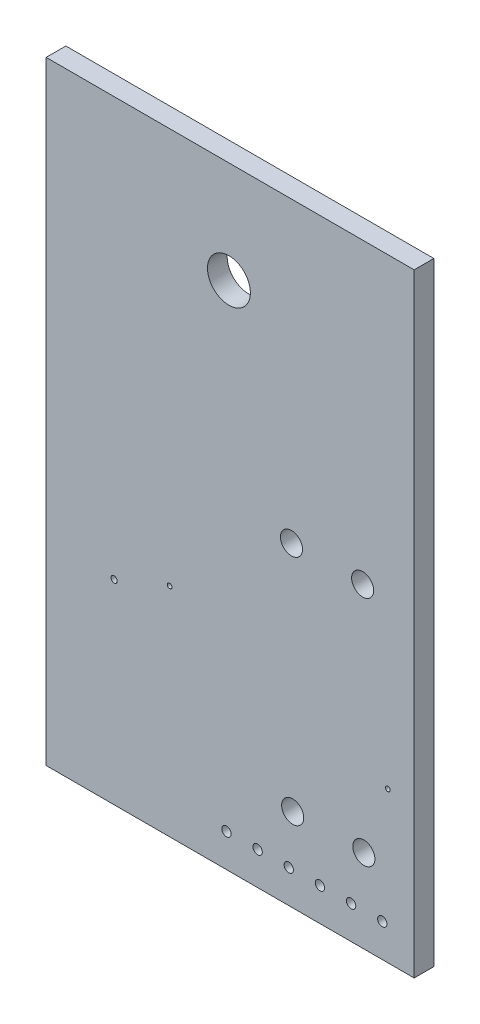
ISO-10303-21;
HEADER;
FILE_DESCRIPTION(('STEP AP214'),'2;1');
FILE_NAME('part.step','',(''),(''),'','','');
FILE_SCHEMA(('AUTOMOTIVE_DESIGN { 1 0 10303 214 1 1 1 1 }'));
ENDSEC;
DATA;
#1=APPLICATION_CONTEXT('core data for automotive mechanical design processes');
#2=APPLICATION_PROTOCOL_DEFINITION('international standard','automotive_design',2000,#1);
#3=PRODUCT_CONTEXT('',#1,'mechanical');
#4=PRODUCT('Part','Part','',(#3));
#5=PRODUCT_RELATED_PRODUCT_CATEGORY('part','',(#4));
#6=PRODUCT_DEFINITION_FORMATION('','',#4);
#7=PRODUCT_DEFINITION_CONTEXT('part definition',#1,'design');
#8=PRODUCT_DEFINITION('design','',#6,#7);
#9=PRODUCT_DEFINITION_SHAPE('','',#8);
#10=(LENGTH_UNIT() NAMED_UNIT(*) SI_UNIT(.MILLI.,.METRE.));
#11=(NAMED_UNIT(*) PLANE_ANGLE_UNIT() SI_UNIT($,.RADIAN.));
#12=(NAMED_UNIT(*) SI_UNIT($,.STERADIAN.) SOLID_ANGLE_UNIT());
#13=UNCERTAINTY_MEASURE_WITH_UNIT(LENGTH_MEASURE(1.E-05),#10,'distance_accuracy_value','');
#14=(GEOMETRIC_REPRESENTATION_CONTEXT(3) GLOBAL_UNCERTAINTY_ASSIGNED_CONTEXT((#13)) GLOBAL_UNIT_ASSIGNED_CONTEXT((#10,
#11,#12)) REPRESENTATION_CONTEXT('',''));
#15=CARTESIAN_POINT('',(0.,0.,0.));
#16=DIRECTION('',(0.,0.,1.));
#17=DIRECTION('',(1.,0.,0.));
#18=AXIS2_PLACEMENT_3D('',#15,#16,#17);
#19=CARTESIAN_POINT('',(0.,50.,-0.803));
#20=DIRECTION('',(0.,0.,-1.));
#21=DIRECTION('',(-1.,0.,0.));
#22=AXIS2_PLACEMENT_3D('',#19,#20,#21);
#23=PLANE('',#22);
#24=CARTESIAN_POINT('',(-24.45854,15.91271,-0.803));
#25=DIRECTION('',(0.,0.,-1.));
#26=DIRECTION('',(-1.,0.,0.));
#27=AXIS2_PLACEMENT_3D('',#24,#25,#26);
#28=CIRCLE('',#27,0.254);
#29=CARTESIAN_POINT('',(-24.71254,15.91271,-0.803));
#30=VERTEX_POINT('',#29);
#31=EDGE_CURVE('E119',#30,#30,#28,.F.);
#32=ORIENTED_EDGE('',*,*,#31,.T.);
#33=EDGE_LOOP('',(#32));
#34=FACE_BOUND('',#33,.T.);
#35=CARTESIAN_POINT('',(-19.93533,17.71295,-0.803));
#36=DIRECTION('',(0.,0.,-1.));
#37=DIRECTION('',(-1.,0.,0.));
#38=AXIS2_PLACEMENT_3D('',#35,#36,#37);
#39=CIRCLE('',#38,0.1905);
#40=CARTESIAN_POINT('',(-20.12583,17.71295,-0.803));
#41=VERTEX_POINT('',#40);
#42=EDGE_CURVE('E122',#41,#41,#39,.F.);
#43=ORIENTED_EDGE('',*,*,#42,.T.);
#44=EDGE_LOOP('',(#43));
#45=FACE_BOUND('',#44,.T.);
#46=CARTESIAN_POINT('',(-15.1,41.7,-0.803));
#47=DIRECTION('',(0.,0.,-1.));
#48=DIRECTION('',(-1.,0.,0.));
#49=AXIS2_PLACEMENT_3D('',#46,#47,#48);
#50=CIRCLE('',#49,1.75);
#51=CARTESIAN_POINT('',(-16.85,41.7,-0.803));
#52=VERTEX_POINT('',#51);
#53=EDGE_CURVE('E125',#52,#52,#50,.F.);
#54=ORIENTED_EDGE('',*,*,#53,.T.);
#55=EDGE_LOOP('',(#54));
#56=FACE_BOUND('',#55,.T.);
#57=CARTESIAN_POINT('',(-12.76,2.7,-0.803));
#58=DIRECTION('',(0.,0.,-1.));
#59=DIRECTION('',(-1.,0.,0.));
#60=AXIS2_PLACEMENT_3D('',#57,#58,#59);
#61=CIRCLE('',#60,0.381);
#62=CARTESIAN_POINT('',(-13.141,2.7,-0.803));
#63=VERTEX_POINT('',#62);
#64=EDGE_CURVE('E128',#63,#63,#61,.F.);
#65=ORIENTED_EDGE('',*,*,#64,.T.);
#66=EDGE_LOOP('',(#65));
#67=FACE_BOUND('',#66,.T.);
#68=CARTESIAN_POINT('',(-15.3,2.7,-0.803));
#69=DIRECTION('',(0.,0.,-1.));
#70=DIRECTION('',(-1.,0.,0.));
#71=AXIS2_PLACEMENT_3D('',#68,#69,#70);
#72=CIRCLE('',#71,0.381);
#73=CARTESIAN_POINT('',(-15.681,2.7,-0.803));
#74=VERTEX_POINT('',#73);
#75=EDGE_CURVE('E131',#74,#74,#72,.F.);
#76=ORIENTED_EDGE('',*,*,#75,.T.);
#77=EDGE_LOOP('',(#76));
#78=FACE_BOUND('',#77,.T.);
#79=CARTESIAN_POINT('',(-9.9,6.8,-0.803));
#80=DIRECTION('',(0.,0.,-1.));
#81=DIRECTION('',(-1.,0.,0.));
#82=AXIS2_PLACEMENT_3D('',#79,#80,#81);
#83=CIRCLE('',#82,0.9);
#84=CARTESIAN_POINT('',(-10.8,6.8,-0.803));
#85=VERTEX_POINT('',#84);
#86=EDGE_CURVE('E134',#85,#85,#83,.F.);
#87=ORIENTED_EDGE('',*,*,#86,.T.);
#88=EDGE_LOOP('',(#87));
#89=FACE_BOUND('',#88,.T.);
#90=CARTESIAN_POINT('',(-10.22,2.7,-0.803));
#91=DIRECTION('',(0.,0.,-1.));
#92=DIRECTION('',(-1.,0.,0.));
#93=AXIS2_PLACEMENT_3D('',#90,#91,#92);
#94=CIRCLE('',#93,0.381);
#95=CARTESIAN_POINT('',(-10.601,2.7,-0.803));
#96=VERTEX_POINT('',#95);
#97=EDGE_CURVE('E137',#96,#96,#94,.F.);
#98=ORIENTED_EDGE('',*,*,#97,.T.);
#99=EDGE_LOOP('',(#98));
#100=FACE_BOUND('',#99,.T.);
#101=CARTESIAN_POINT('',(-4.1,6.8,-0.803));
#102=DIRECTION('',(0.,0.,-1.));
#103=DIRECTION('',(-1.,0.,0.));
#104=AXIS2_PLACEMENT_3D('',#101,#102,#103);
#105=CIRCLE('',#104,0.9);
#106=CARTESIAN_POINT('',(-5.,6.8,-0.803));
#107=VERTEX_POINT('',#106);
#108=EDGE_CURVE('E140',#107,#107,#105,.F.);
#109=ORIENTED_EDGE('',*,*,#108,.T.);
#110=EDGE_LOOP('',(#109));
#111=FACE_BOUND('',#110,.T.);
#112=CARTESIAN_POINT('',(-5.14,2.7,-0.803));
#113=DIRECTION('',(0.,0.,-1.));
#114=DIRECTION('',(-1.,0.,0.));
#115=AXIS2_PLACEMENT_3D('',#112,#113,#114);
#116=CIRCLE('',#115,0.381);
#117=CARTESIAN_POINT('',(-5.521,2.7,-0.803));
#118=VERTEX_POINT('',#117);
#119=EDGE_CURVE('E143',#118,#118,#116,.F.);
#120=ORIENTED_EDGE('',*,*,#119,.T.);
#121=EDGE_LOOP('',(#120));
#122=FACE_BOUND('',#121,.T.);
#123=CARTESIAN_POINT('',(-7.68,2.7,-0.803));
#124=DIRECTION('',(0.,0.,-1.));
#125=DIRECTION('',(-1.,0.,0.));
#126=AXIS2_PLACEMENT_3D('',#123,#124,#125);
#127=CIRCLE('',#126,0.381);
#128=CARTESIAN_POINT('',(-8.061,2.7,-0.803));
#129=VERTEX_POINT('',#128);
#130=EDGE_CURVE('E146',#129,#129,#127,.F.);
#131=ORIENTED_EDGE('',*,*,#130,.T.);
#132=EDGE_LOOP('',(#131));
#133=FACE_BOUND('',#132,.T.);
#134=CARTESIAN_POINT('',(-2.15327,12.27531,-0.803));
#135=DIRECTION('',(0.,0.,-1.));
#136=DIRECTION('',(-1.,0.,0.));
#137=AXIS2_PLACEMENT_3D('',#134,#135,#136);
#138=CIRCLE('',#137,0.1905);
#139=CARTESIAN_POINT('',(-2.34377,12.27531,-0.803));
#140=VERTEX_POINT('',#139);
#141=EDGE_CURVE('E149',#140,#140,#138,.F.);
#142=ORIENTED_EDGE('',*,*,#141,.T.);
#143=EDGE_LOOP('',(#142));
#144=FACE_BOUND('',#143,.T.);
#145=CARTESIAN_POINT('',(-2.6,2.7,-0.803));
#146=DIRECTION('',(0.,0.,-1.));
#147=DIRECTION('',(-1.,0.,0.));
#148=AXIS2_PLACEMENT_3D('',#145,#146,#147);
#149=CIRCLE('',#148,0.381);
#150=CARTESIAN_POINT('',(-2.981,2.7,-0.803));
#151=VERTEX_POINT('',#150);
#152=EDGE_CURVE('E152',#151,#151,#149,.F.);
#153=ORIENTED_EDGE('',*,*,#152,.T.);
#154=EDGE_LOOP('',(#153));
#155=FACE_BOUND('',#154,.T.);
#156=CARTESIAN_POINT('',(-4.2,25.7,-0.803));
#157=DIRECTION('',(0.,0.,-1.));
#158=DIRECTION('',(-1.,0.,0.));
#159=AXIS2_PLACEMENT_3D('',#156,#157,#158);
#160=CIRCLE('',#159,0.9);
#161=CARTESIAN_POINT('',(-5.1,25.7,-0.803));
#162=VERTEX_POINT('',#161);
#163=EDGE_CURVE('E154',#162,#162,#160,.F.);
#164=ORIENTED_EDGE('',*,*,#163,.T.);
#165=EDGE_LOOP('',(#164));
#166=FACE_BOUND('',#165,.T.);
#167=CARTESIAN_POINT('',(-10.,25.7,-0.803));
#168=DIRECTION('',(0.,0.,-1.));
#169=DIRECTION('',(-1.,0.,0.));
#170=AXIS2_PLACEMENT_3D('',#167,#168,#169);
#171=CIRCLE('',#170,0.9);
#172=CARTESIAN_POINT('',(-10.9,25.7,-0.803));
#173=VERTEX_POINT('',#172);
#174=EDGE_CURVE('E20',#173,#173,#171,.F.);
#175=ORIENTED_EDGE('',*,*,#174,.T.);
#176=EDGE_LOOP('',(#175));
#177=FACE_BOUND('',#176,.T.);
#178=DIRECTION('',(1.,0.,0.));
#179=VECTOR('',#178,1.);
#180=CARTESIAN_POINT('',(-30.,0.,-0.803));
#181=LINE('',#180,#179);
#182=CARTESIAN_POINT('',(0.,0.,-0.803));
#183=VERTEX_POINT('',#182);
#184=CARTESIAN_POINT('',(-30.,0.,-0.803));
#185=VERTEX_POINT('',#184);
#186=EDGE_CURVE('E168',#183,#185,#181,.F.);
#187=ORIENTED_EDGE('',*,*,#186,.T.);
#188=DIRECTION('',(0.,1.,0.));
#189=VECTOR('',#188,1.);
#190=CARTESIAN_POINT('',(-30.,50.,-0.803));
#191=LINE('',#190,#189);
#192=CARTESIAN_POINT('',(-30.,50.,-0.803));
#193=VERTEX_POINT('',#192);
#194=EDGE_CURVE('E60',#185,#193,#191,.T.);
#195=ORIENTED_EDGE('',*,*,#194,.T.);
#196=DIRECTION('',(1.,0.,0.));
#197=VECTOR('',#196,1.);
#198=CARTESIAN_POINT('',(0.,50.,-0.803));
#199=LINE('',#198,#197);
#200=CARTESIAN_POINT('',(0.,50.,-0.803));
#201=VERTEX_POINT('',#200);
#202=EDGE_CURVE('E59',#193,#201,#199,.T.);
#203=ORIENTED_EDGE('',*,*,#202,.T.);
#204=DIRECTION('',(0.,1.,0.));
#205=VECTOR('',#204,1.);
#206=CARTESIAN_POINT('',(0.,0.,-0.803));
#207=LINE('',#206,#205);
#208=EDGE_CURVE('E56',#201,#183,#207,.F.);
#209=ORIENTED_EDGE('',*,*,#208,.T.);
#210=EDGE_LOOP('',(#187,#195,#203,#209));
#211=FACE_BOUND('',#210,.T.);
#212=ADVANCED_FACE('F17',(#34,#45,#56,#67,#78,#89,#100,#111,#122,#133,#144,#155,#166,#177,#211),
#23,.T.);
#213=CARTESIAN_POINT('',(0.,50.,-0.803));
#214=DIRECTION('',(0.,-1.,0.));
#215=DIRECTION('',(0.,0.,-1.));
#216=AXIS2_PLACEMENT_3D('',#213,#214,#215);
#217=PLANE('',#216);
#218=DIRECTION('',(0.,0.,-1.));
#219=VECTOR('',#218,1.);
#220=CARTESIAN_POINT('',(-30.,50.,-0.803));
#221=LINE('',#220,#219);
#222=CARTESIAN_POINT('',(-30.,50.,0.803));
#223=VERTEX_POINT('',#222);
#224=EDGE_CURVE('E162',#193,#223,#221,.F.);
#225=ORIENTED_EDGE('',*,*,#224,.T.);
#226=DIRECTION('',(-1.,0.,0.));
#227=VECTOR('',#226,1.);
#228=CARTESIAN_POINT('',(0.,50.,0.803));
#229=LINE('',#228,#227);
#230=CARTESIAN_POINT('',(0.,50.,0.803));
#231=VERTEX_POINT('',#230);
#232=EDGE_CURVE('E76',#223,#231,#229,.F.);
#233=ORIENTED_EDGE('',*,*,#232,.T.);
#234=DIRECTION('',(0.,0.,1.));
#235=VECTOR('',#234,1.);
#236=CARTESIAN_POINT('',(0.,50.,-0.803));
#237=LINE('',#236,#235);
#238=EDGE_CURVE('E65',#231,#201,#237,.F.);
#239=ORIENTED_EDGE('',*,*,#238,.T.);
#240=ORIENTED_EDGE('',*,*,#202,.F.);
#241=EDGE_LOOP('',(#225,#233,#239,#240));
#242=FACE_BOUND('',#241,.T.);
#243=ADVANCED_FACE('F75',(#242),#217,.F.);
#244=CARTESIAN_POINT('',(0.,0.,-0.803));
#245=DIRECTION('',(-1.,0.,0.));
#246=DIRECTION('',(0.,0.,1.));
#247=AXIS2_PLACEMENT_3D('',#244,#245,#246);
#248=PLANE('',#247);
#249=ORIENTED_EDGE('',*,*,#238,.F.);
#250=DIRECTION('',(0.,1.,0.));
#251=VECTOR('',#250,1.);
#252=CARTESIAN_POINT('',(0.,50.,0.803));
#253=LINE('',#252,#251);
#254=CARTESIAN_POINT('',(0.,0.,0.803));
#255=VERTEX_POINT('',#254);
#256=EDGE_CURVE('E176',#231,#255,#253,.F.);
#257=ORIENTED_EDGE('',*,*,#256,.T.);
#258=DIRECTION('',(0.,0.,1.));
#259=VECTOR('',#258,1.);
#260=CARTESIAN_POINT('',(0.,0.,-0.803));
#261=LINE('',#260,#259);
#262=EDGE_CURVE('E72',#255,#183,#261,.F.);
#263=ORIENTED_EDGE('',*,*,#262,.T.);
#264=ORIENTED_EDGE('',*,*,#208,.F.);
#265=EDGE_LOOP('',(#249,#257,#263,#264));
#266=FACE_BOUND('',#265,.T.);
#267=ADVANCED_FACE('F69',(#266),#248,.F.);
#268=CARTESIAN_POINT('',(-30.,0.,-0.803));
#269=DIRECTION('',(0.,1.,0.));
#270=DIRECTION('',(0.,0.,1.));
#271=AXIS2_PLACEMENT_3D('',#268,#269,#270);
#272=PLANE('',#271);
#273=ORIENTED_EDGE('',*,*,#262,.F.);
#274=DIRECTION('',(-1.,0.,0.));
#275=VECTOR('',#274,1.);
#276=CARTESIAN_POINT('',(0.,0.,0.803));
#277=LINE('',#276,#275);
#278=CARTESIAN_POINT('',(-30.,0.,0.803));
#279=VERTEX_POINT('',#278);
#280=EDGE_CURVE('E174',#255,#279,#277,.T.);
#281=ORIENTED_EDGE('',*,*,#280,.T.);
#282=DIRECTION('',(0.,0.,-1.));
#283=VECTOR('',#282,1.);
#284=CARTESIAN_POINT('',(-30.,0.,-0.803));
#285=LINE('',#284,#283);
#286=EDGE_CURVE('E35',#279,#185,#285,.T.);
#287=ORIENTED_EDGE('',*,*,#286,.T.);
#288=ORIENTED_EDGE('',*,*,#186,.F.);
#289=EDGE_LOOP('',(#273,#281,#287,#288));
#290=FACE_BOUND('',#289,.T.);
#291=ADVANCED_FACE('F172',(#290),#272,.F.);
#292=CARTESIAN_POINT('',(-30.,50.,-0.803));
#293=DIRECTION('',(1.,0.,0.));
#294=DIRECTION('',(0.,0.,-1.));
#295=AXIS2_PLACEMENT_3D('',#292,#293,#294);
#296=PLANE('',#295);
#297=ORIENTED_EDGE('',*,*,#286,.F.);
#298=DIRECTION('',(0.,1.,0.));
#299=VECTOR('',#298,1.);
#300=CARTESIAN_POINT('',(-30.,50.,0.803));
#301=LINE('',#300,#299);
#302=EDGE_CURVE('E118',#279,#223,#301,.T.);
#303=ORIENTED_EDGE('',*,*,#302,.T.);
#304=ORIENTED_EDGE('',*,*,#224,.F.);
#305=ORIENTED_EDGE('',*,*,#194,.F.);
#306=EDGE_LOOP('',(#297,#303,#304,#305));
#307=FACE_BOUND('',#306,.T.);
#308=ADVANCED_FACE('F170',(#307),#296,.F.);
#309=CARTESIAN_POINT('',(-10.,25.7,-0.803));
#310=DIRECTION('',(0.,0.,-1.));
#311=DIRECTION('',(-1.,0.,0.));
#312=AXIS2_PLACEMENT_3D('',#309,#310,#311);
#313=CYLINDRICAL_SURFACE('',#312,0.9);
#314=CARTESIAN_POINT('',(-10.,25.7,0.803));
#315=DIRECTION('',(0.,0.,-1.));
#316=DIRECTION('',(-1.,0.,0.));
#317=AXIS2_PLACEMENT_3D('',#314,#315,#316);
#318=CIRCLE('',#317,0.9);
#319=CARTESIAN_POINT('',(-10.9,25.7,0.803));
#320=VERTEX_POINT('',#319);
#321=EDGE_CURVE('E115',#320,#320,#318,.F.);
#322=ORIENTED_EDGE('',*,*,#321,.T.);
#323=EDGE_LOOP('',(#322));
#324=FACE_BOUND('',#323,.T.);
#325=ORIENTED_EDGE('',*,*,#174,.F.);
#326=EDGE_LOOP('',(#325));
#327=FACE_BOUND('',#326,.T.);
#328=ADVANCED_FACE('F240',(#324,#327),#313,.F.);
#329=CARTESIAN_POINT('',(-4.2,25.7,-0.803));
#330=DIRECTION('',(0.,0.,-1.));
#331=DIRECTION('',(-1.,0.,0.));
#332=AXIS2_PLACEMENT_3D('',#329,#330,#331);
#333=CYLINDRICAL_SURFACE('',#332,0.9);
#334=CARTESIAN_POINT('',(-4.2,25.7,0.803));
#335=DIRECTION('',(0.,0.,-1.));
#336=DIRECTION('',(-1.,0.,0.));
#337=AXIS2_PLACEMENT_3D('',#334,#335,#336);
#338=CIRCLE('',#337,0.9);
#339=CARTESIAN_POINT('',(-5.1,25.7,0.803));
#340=VERTEX_POINT('',#339);
#341=EDGE_CURVE('E112',#340,#340,#338,.F.);
#342=ORIENTED_EDGE('',*,*,#341,.T.);
#343=EDGE_LOOP('',(#342));
#344=FACE_BOUND('',#343,.T.);
#345=ORIENTED_EDGE('',*,*,#163,.F.);
#346=EDGE_LOOP('',(#345));
#347=FACE_BOUND('',#346,.T.);
#348=ADVANCED_FACE('F236',(#344,#347),#333,.F.);
#349=CARTESIAN_POINT('',(-2.6,2.7,-0.803));
#350=DIRECTION('',(0.,0.,-1.));
#351=DIRECTION('',(-1.,0.,0.));
#352=AXIS2_PLACEMENT_3D('',#349,#350,#351);
#353=CYLINDRICAL_SURFACE('',#352,0.381);
#354=CARTESIAN_POINT('',(-2.6,2.7,0.803));
#355=DIRECTION('',(0.,0.,-1.));
#356=DIRECTION('',(-1.,0.,0.));
#357=AXIS2_PLACEMENT_3D('',#354,#355,#356);
#358=CIRCLE('',#357,0.381);
#359=CARTESIAN_POINT('',(-2.981,2.7,0.803));
#360=VERTEX_POINT('',#359);
#361=EDGE_CURVE('E109',#360,#360,#358,.F.);
#362=ORIENTED_EDGE('',*,*,#361,.T.);
#363=EDGE_LOOP('',(#362));
#364=FACE_BOUND('',#363,.T.);
#365=ORIENTED_EDGE('',*,*,#152,.F.);
#366=EDGE_LOOP('',(#365));
#367=FACE_BOUND('',#366,.T.);
#368=ADVANCED_FACE('F232',(#364,#367),#353,.F.);
#369=CARTESIAN_POINT('',(-2.15327,12.27531,-0.803));
#370=DIRECTION('',(0.,0.,-1.));
#371=DIRECTION('',(-1.,0.,0.));
#372=AXIS2_PLACEMENT_3D('',#369,#370,#371);
#373=CYLINDRICAL_SURFACE('',#372,0.1905);
#374=CARTESIAN_POINT('',(-2.15327,12.27531,0.803));
#375=DIRECTION('',(0.,0.,-1.));
#376=DIRECTION('',(-1.,0.,0.));
#377=AXIS2_PLACEMENT_3D('',#374,#375,#376);
#378=CIRCLE('',#377,0.1905);
#379=CARTESIAN_POINT('',(-2.34377,12.27531,0.803));
#380=VERTEX_POINT('',#379);
#381=EDGE_CURVE('E106',#380,#380,#378,.F.);
#382=ORIENTED_EDGE('',*,*,#381,.T.);
#383=EDGE_LOOP('',(#382));
#384=FACE_BOUND('',#383,.T.);
#385=ORIENTED_EDGE('',*,*,#141,.F.);
#386=EDGE_LOOP('',(#385));
#387=FACE_BOUND('',#386,.T.);
#388=ADVANCED_FACE('F228',(#384,#387),#373,.F.);
#389=CARTESIAN_POINT('',(-7.68,2.7,-0.803));
#390=DIRECTION('',(0.,0.,-1.));
#391=DIRECTION('',(-1.,0.,0.));
#392=AXIS2_PLACEMENT_3D('',#389,#390,#391);
#393=CYLINDRICAL_SURFACE('',#392,0.381);
#394=CARTESIAN_POINT('',(-7.68,2.7,0.803));
#395=DIRECTION('',(0.,0.,-1.));
#396=DIRECTION('',(-1.,0.,0.));
#397=AXIS2_PLACEMENT_3D('',#394,#395,#396);
#398=CIRCLE('',#397,0.381);
#399=CARTESIAN_POINT('',(-8.061,2.7,0.803));
#400=VERTEX_POINT('',#399);
#401=EDGE_CURVE('E103',#400,#400,#398,.F.);
#402=ORIENTED_EDGE('',*,*,#401,.T.);
#403=EDGE_LOOP('',(#402));
#404=FACE_BOUND('',#403,.T.);
#405=ORIENTED_EDGE('',*,*,#130,.F.);
#406=EDGE_LOOP('',(#405));
#407=FACE_BOUND('',#406,.T.);
#408=ADVANCED_FACE('F224',(#404,#407),#393,.F.);
#409=CARTESIAN_POINT('',(-5.14,2.7,-0.803));
#410=DIRECTION('',(0.,0.,-1.));
#411=DIRECTION('',(-1.,0.,0.));
#412=AXIS2_PLACEMENT_3D('',#409,#410,#411);
#413=CYLINDRICAL_SURFACE('',#412,0.381);
#414=CARTESIAN_POINT('',(-5.14,2.7,0.803));
#415=DIRECTION('',(0.,0.,-1.));
#416=DIRECTION('',(-1.,0.,0.));
#417=AXIS2_PLACEMENT_3D('',#414,#415,#416);
#418=CIRCLE('',#417,0.381);
#419=CARTESIAN_POINT('',(-5.521,2.7,0.803));
#420=VERTEX_POINT('',#419);
#421=EDGE_CURVE('E100',#420,#420,#418,.F.);
#422=ORIENTED_EDGE('',*,*,#421,.T.);
#423=EDGE_LOOP('',(#422));
#424=FACE_BOUND('',#423,.T.);
#425=ORIENTED_EDGE('',*,*,#119,.F.);
#426=EDGE_LOOP('',(#425));
#427=FACE_BOUND('',#426,.T.);
#428=ADVANCED_FACE('F220',(#424,#427),#413,.F.);
#429=CARTESIAN_POINT('',(-4.1,6.8,-0.803));
#430=DIRECTION('',(0.,0.,-1.));
#431=DIRECTION('',(-1.,0.,0.));
#432=AXIS2_PLACEMENT_3D('',#429,#430,#431);
#433=CYLINDRICAL_SURFACE('',#432,0.9);
#434=CARTESIAN_POINT('',(-4.1,6.8,0.803));
#435=DIRECTION('',(0.,0.,-1.));
#436=DIRECTION('',(-1.,0.,0.));
#437=AXIS2_PLACEMENT_3D('',#434,#435,#436);
#438=CIRCLE('',#437,0.9);
#439=CARTESIAN_POINT('',(-5.,6.8,0.803));
#440=VERTEX_POINT('',#439);
#441=EDGE_CURVE('E97',#440,#440,#438,.F.);
#442=ORIENTED_EDGE('',*,*,#441,.T.);
#443=EDGE_LOOP('',(#442));
#444=FACE_BOUND('',#443,.T.);
#445=ORIENTED_EDGE('',*,*,#108,.F.);
#446=EDGE_LOOP('',(#445));
#447=FACE_BOUND('',#446,.T.);
#448=ADVANCED_FACE('F216',(#444,#447),#433,.F.);
#449=CARTESIAN_POINT('',(-10.22,2.7,-0.803));
#450=DIRECTION('',(0.,0.,-1.));
#451=DIRECTION('',(-1.,0.,0.));
#452=AXIS2_PLACEMENT_3D('',#449,#450,#451);
#453=CYLINDRICAL_SURFACE('',#452,0.381);
#454=CARTESIAN_POINT('',(-10.22,2.7,0.803));
#455=DIRECTION('',(0.,0.,-1.));
#456=DIRECTION('',(-1.,0.,0.));
#457=AXIS2_PLACEMENT_3D('',#454,#455,#456);
#458=CIRCLE('',#457,0.381);
#459=CARTESIAN_POINT('',(-10.601,2.7,0.803));
#460=VERTEX_POINT('',#459);
#461=EDGE_CURVE('E94',#460,#460,#458,.F.);
#462=ORIENTED_EDGE('',*,*,#461,.T.);
#463=EDGE_LOOP('',(#462));
#464=FACE_BOUND('',#463,.T.);
#465=ORIENTED_EDGE('',*,*,#97,.F.);
#466=EDGE_LOOP('',(#465));
#467=FACE_BOUND('',#466,.T.);
#468=ADVANCED_FACE('F212',(#464,#467),#453,.F.);
#469=CARTESIAN_POINT('',(-9.9,6.8,-0.803));
#470=DIRECTION('',(0.,0.,-1.));
#471=DIRECTION('',(-1.,0.,0.));
#472=AXIS2_PLACEMENT_3D('',#469,#470,#471);
#473=CYLINDRICAL_SURFACE('',#472,0.9);
#474=CARTESIAN_POINT('',(-9.9,6.8,0.803));
#475=DIRECTION('',(0.,0.,-1.));
#476=DIRECTION('',(-1.,0.,0.));
#477=AXIS2_PLACEMENT_3D('',#474,#475,#476);
#478=CIRCLE('',#477,0.9);
#479=CARTESIAN_POINT('',(-10.8,6.8,0.803));
#480=VERTEX_POINT('',#479);
#481=EDGE_CURVE('E91',#480,#480,#478,.F.);
#482=ORIENTED_EDGE('',*,*,#481,.T.);
#483=EDGE_LOOP('',(#482));
#484=FACE_BOUND('',#483,.T.);
#485=ORIENTED_EDGE('',*,*,#86,.F.);
#486=EDGE_LOOP('',(#485));
#487=FACE_BOUND('',#486,.T.);
#488=ADVANCED_FACE('F208',(#484,#487),#473,.F.);
#489=CARTESIAN_POINT('',(-15.3,2.7,-0.803));
#490=DIRECTION('',(0.,0.,-1.));
#491=DIRECTION('',(-1.,0.,0.));
#492=AXIS2_PLACEMENT_3D('',#489,#490,#491);
#493=CYLINDRICAL_SURFACE('',#492,0.381);
#494=CARTESIAN_POINT('',(-15.3,2.7,0.803));
#495=DIRECTION('',(0.,0.,-1.));
#496=DIRECTION('',(-1.,0.,0.));
#497=AXIS2_PLACEMENT_3D('',#494,#495,#496);
#498=CIRCLE('',#497,0.381);
#499=CARTESIAN_POINT('',(-15.681,2.7,0.803));
#500=VERTEX_POINT('',#499);
#501=EDGE_CURVE('E88',#500,#500,#498,.F.);
#502=ORIENTED_EDGE('',*,*,#501,.T.);
#503=EDGE_LOOP('',(#502));
#504=FACE_BOUND('',#503,.T.);
#505=ORIENTED_EDGE('',*,*,#75,.F.);
#506=EDGE_LOOP('',(#505));
#507=FACE_BOUND('',#506,.T.);
#508=ADVANCED_FACE('F204',(#504,#507),#493,.F.);
#509=CARTESIAN_POINT('',(-12.76,2.7,-0.803));
#510=DIRECTION('',(0.,0.,-1.));
#511=DIRECTION('',(-1.,0.,0.));
#512=AXIS2_PLACEMENT_3D('',#509,#510,#511);
#513=CYLINDRICAL_SURFACE('',#512,0.381);
#514=CARTESIAN_POINT('',(-12.76,2.7,0.803));
#515=DIRECTION('',(0.,0.,-1.));
#516=DIRECTION('',(-1.,0.,0.));
#517=AXIS2_PLACEMENT_3D('',#514,#515,#516);
#518=CIRCLE('',#517,0.381);
#519=CARTESIAN_POINT('',(-13.141,2.7,0.803));
#520=VERTEX_POINT('',#519);
#521=EDGE_CURVE('E85',#520,#520,#518,.F.);
#522=ORIENTED_EDGE('',*,*,#521,.T.);
#523=EDGE_LOOP('',(#522));
#524=FACE_BOUND('',#523,.T.);
#525=ORIENTED_EDGE('',*,*,#64,.F.);
#526=EDGE_LOOP('',(#525));
#527=FACE_BOUND('',#526,.T.);
#528=ADVANCED_FACE('F200',(#524,#527),#513,.F.);
#529=CARTESIAN_POINT('',(-15.1,41.7,-0.803));
#530=DIRECTION('',(0.,0.,-1.));
#531=DIRECTION('',(-1.,0.,0.));
#532=AXIS2_PLACEMENT_3D('',#529,#530,#531);
#533=CYLINDRICAL_SURFACE('',#532,1.75);
#534=CARTESIAN_POINT('',(-15.1,41.7,0.803));
#535=DIRECTION('',(0.,0.,-1.));
#536=DIRECTION('',(-1.,0.,0.));
#537=AXIS2_PLACEMENT_3D('',#534,#535,#536);
#538=CIRCLE('',#537,1.75);
#539=CARTESIAN_POINT('',(-16.85,41.7,0.803));
#540=VERTEX_POINT('',#539);
#541=EDGE_CURVE('E82',#540,#540,#538,.F.);
#542=ORIENTED_EDGE('',*,*,#541,.T.);
#543=EDGE_LOOP('',(#542));
#544=FACE_BOUND('',#543,.T.);
#545=ORIENTED_EDGE('',*,*,#53,.F.);
#546=EDGE_LOOP('',(#545));
#547=FACE_BOUND('',#546,.T.);
#548=ADVANCED_FACE('F196',(#544,#547),#533,.F.);
#549=CARTESIAN_POINT('',(-19.93533,17.71295,-0.803));
#550=DIRECTION('',(0.,0.,-1.));
#551=DIRECTION('',(-1.,0.,0.));
#552=AXIS2_PLACEMENT_3D('',#549,#550,#551);
#553=CYLINDRICAL_SURFACE('',#552,0.1905);
#554=CARTESIAN_POINT('',(-19.93533,17.71295,0.803));
#555=DIRECTION('',(0.,0.,-1.));
#556=DIRECTION('',(-1.,0.,0.));
#557=AXIS2_PLACEMENT_3D('',#554,#555,#556);
#558=CIRCLE('',#557,0.1905);
#559=CARTESIAN_POINT('',(-20.12583,17.71295,0.803));
#560=VERTEX_POINT('',#559);
#561=EDGE_CURVE('E26',#560,#560,#558,.F.);
#562=ORIENTED_EDGE('',*,*,#561,.T.);
#563=EDGE_LOOP('',(#562));
#564=FACE_BOUND('',#563,.T.);
#565=ORIENTED_EDGE('',*,*,#42,.F.);
#566=EDGE_LOOP('',(#565));
#567=FACE_BOUND('',#566,.T.);
#568=ADVANCED_FACE('F188',(#564,#567),#553,.F.);
#569=CARTESIAN_POINT('',(-24.45854,15.91271,-0.803));
#570=DIRECTION('',(0.,0.,-1.));
#571=DIRECTION('',(-1.,0.,0.));
#572=AXIS2_PLACEMENT_3D('',#569,#570,#571);
#573=CYLINDRICAL_SURFACE('',#572,0.254);
#574=CARTESIAN_POINT('',(-24.45854,15.91271,0.803));
#575=DIRECTION('',(0.,0.,-1.));
#576=DIRECTION('',(-1.,0.,0.));
#577=AXIS2_PLACEMENT_3D('',#574,#575,#576);
#578=CIRCLE('',#577,0.254);
#579=CARTESIAN_POINT('',(-24.71254,15.91271,0.803));
#580=VERTEX_POINT('',#579);
#581=EDGE_CURVE('E11',#580,#580,#578,.F.);
#582=ORIENTED_EDGE('',*,*,#581,.T.);
#583=EDGE_LOOP('',(#582));
#584=FACE_BOUND('',#583,.T.);
#585=ORIENTED_EDGE('',*,*,#31,.F.);
#586=EDGE_LOOP('',(#585));
#587=FACE_BOUND('',#586,.T.);
#588=ADVANCED_FACE('F181',(#584,#587),#573,.F.);
#589=CARTESIAN_POINT('',(0.,50.,0.803));
#590=DIRECTION('',(0.,0.,-1.));
#591=DIRECTION('',(-1.,0.,0.));
#592=AXIS2_PLACEMENT_3D('',#589,#590,#591);
#593=PLANE('',#592);
#594=ORIENTED_EDGE('',*,*,#581,.F.);
#595=EDGE_LOOP('',(#594));
#596=FACE_BOUND('',#595,.T.);
#597=ORIENTED_EDGE('',*,*,#561,.F.);
#598=EDGE_LOOP('',(#597));
#599=FACE_BOUND('',#598,.T.);
#600=ORIENTED_EDGE('',*,*,#541,.F.);
#601=EDGE_LOOP('',(#600));
#602=FACE_BOUND('',#601,.T.);
#603=ORIENTED_EDGE('',*,*,#521,.F.);
#604=EDGE_LOOP('',(#603));
#605=FACE_BOUND('',#604,.T.);
#606=ORIENTED_EDGE('',*,*,#501,.F.);
#607=EDGE_LOOP('',(#606));
#608=FACE_BOUND('',#607,.T.);
#609=ORIENTED_EDGE('',*,*,#481,.F.);
#610=EDGE_LOOP('',(#609));
#611=FACE_BOUND('',#610,.T.);
#612=ORIENTED_EDGE('',*,*,#461,.F.);
#613=EDGE_LOOP('',(#612));
#614=FACE_BOUND('',#613,.T.);
#615=ORIENTED_EDGE('',*,*,#441,.F.);
#616=EDGE_LOOP('',(#615));
#617=FACE_BOUND('',#616,.T.);
#618=ORIENTED_EDGE('',*,*,#421,.F.);
#619=EDGE_LOOP('',(#618));
#620=FACE_BOUND('',#619,.T.);
#621=ORIENTED_EDGE('',*,*,#401,.F.);
#622=EDGE_LOOP('',(#621));
#623=FACE_BOUND('',#622,.T.);
#624=ORIENTED_EDGE('',*,*,#381,.F.);
#625=EDGE_LOOP('',(#624));
#626=FACE_BOUND('',#625,.T.);
#627=ORIENTED_EDGE('',*,*,#361,.F.);
#628=EDGE_LOOP('',(#627));
#629=FACE_BOUND('',#628,.T.);
#630=ORIENTED_EDGE('',*,*,#341,.F.);
#631=EDGE_LOOP('',(#630));
#632=FACE_BOUND('',#631,.T.);
#633=ORIENTED_EDGE('',*,*,#321,.F.);
#634=EDGE_LOOP('',(#633));
#635=FACE_BOUND('',#634,.T.);
#636=ORIENTED_EDGE('',*,*,#280,.F.);
#637=ORIENTED_EDGE('',*,*,#256,.F.);
#638=ORIENTED_EDGE('',*,*,#232,.F.);
#639=ORIENTED_EDGE('',*,*,#302,.F.);
#640=EDGE_LOOP('',(#636,#637,#638,#639));
#641=FACE_BOUND('',#640,.T.);
#642=ADVANCED_FACE('F179',(#596,#599,#602,#605,#608,#611,#614,#617,#620,#623,#626,#629,#632,
#635,#641),#593,.F.);
#643=CLOSED_SHELL('',(#212,#243,#267,#291,#308,#328,#348,#368,#388,#408,#428,#448,#468,#488,
#508,#528,#548,#568,#588,#642));
#644=MANIFOLD_SOLID_BREP('B1',#643);
#645=ADVANCED_BREP_SHAPE_REPRESENTATION('',(#18,#644),#14);
#646=SHAPE_DEFINITION_REPRESENTATION(#9,#645);
ENDSEC;
END-ISO-10303-21;
